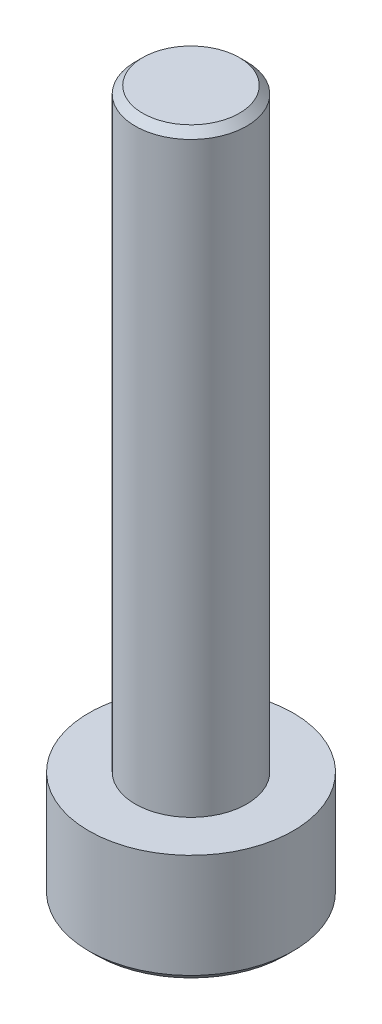
ISO-10303-21;
HEADER;
FILE_DESCRIPTION(('STEP AP214'),'2;1');
FILE_NAME('part.step','',(''),(''),'','','');
FILE_SCHEMA(('AUTOMOTIVE_DESIGN { 1 0 10303 214 1 1 1 1 }'));
ENDSEC;
DATA;
#1=APPLICATION_CONTEXT('core data for automotive mechanical design processes');
#2=APPLICATION_PROTOCOL_DEFINITION('international standard','automotive_design',2000,#1);
#3=PRODUCT_CONTEXT('',#1,'mechanical');
#4=PRODUCT('Part','Part','',(#3));
#5=PRODUCT_RELATED_PRODUCT_CATEGORY('part','',(#4));
#6=PRODUCT_DEFINITION_FORMATION('','',#4);
#7=PRODUCT_DEFINITION_CONTEXT('part definition',#1,'design');
#8=PRODUCT_DEFINITION('design','',#6,#7);
#9=PRODUCT_DEFINITION_SHAPE('','',#8);
#10=(LENGTH_UNIT() NAMED_UNIT(*) SI_UNIT(.MILLI.,.METRE.));
#11=(NAMED_UNIT(*) PLANE_ANGLE_UNIT() SI_UNIT($,.RADIAN.));
#12=(NAMED_UNIT(*) SI_UNIT($,.STERADIAN.) SOLID_ANGLE_UNIT());
#13=UNCERTAINTY_MEASURE_WITH_UNIT(LENGTH_MEASURE(1.E-05),#10,'distance_accuracy_value','');
#14=(GEOMETRIC_REPRESENTATION_CONTEXT(3) GLOBAL_UNCERTAINTY_ASSIGNED_CONTEXT((#13)) GLOBAL_UNIT_ASSIGNED_CONTEXT((#10,
#11,#12)) REPRESENTATION_CONTEXT('',''));
#15=CARTESIAN_POINT('',(0.,0.,0.));
#16=DIRECTION('',(0.,0.,1.));
#17=DIRECTION('',(1.,0.,0.));
#18=AXIS2_PLACEMENT_3D('',#15,#16,#17);
#19=CARTESIAN_POINT('',(0.,-3.,0.));
#20=DIRECTION('',(0.,-1.,0.));
#21=DIRECTION('',(0.,0.,-1.));
#22=AXIS2_PLACEMENT_3D('',#19,#20,#21);
#23=PLANE('',#22);
#24=CARTESIAN_POINT('',(0.,-3.,0.));
#25=DIRECTION('',(0.,-1.,0.));
#26=DIRECTION('',(0.,0.,-1.));
#27=AXIS2_PLACEMENT_3D('',#24,#25,#26);
#28=CIRCLE('',#27,2.55);
#29=CARTESIAN_POINT('',(0.,-3.,-2.55));
#30=VERTEX_POINT('',#29);
#31=EDGE_CURVE('E11',#30,#30,#28,.T.);
#32=ORIENTED_EDGE('',*,*,#31,.T.);
#33=EDGE_LOOP('',(#32));
#34=FACE_BOUND('',#33,.T.);
#35=DIRECTION('',(0.5,0.,-0.866025403784439));
#36=VECTOR('',#35,1.);
#37=CARTESIAN_POINT('',(1.44337567297406,-3.,0.));
#38=LINE('',#37,#36);
#39=CARTESIAN_POINT('',(0.721687836487032,-3.,1.25));
#40=VERTEX_POINT('',#39);
#41=CARTESIAN_POINT('',(1.44337567297406,-3.,0.));
#42=VERTEX_POINT('',#41);
#43=EDGE_CURVE('E127',#40,#42,#38,.T.);
#44=ORIENTED_EDGE('',*,*,#43,.T.);
#45=DIRECTION('',(-0.5,0.,-0.866025403784439));
#46=VECTOR('',#45,1.);
#47=CARTESIAN_POINT('',(0.721687836487032,-3.,-1.25));
#48=LINE('',#47,#46);
#49=CARTESIAN_POINT('',(0.721687836487032,-3.,-1.25));
#50=VERTEX_POINT('',#49);
#51=EDGE_CURVE('E47',#42,#50,#48,.T.);
#52=ORIENTED_EDGE('',*,*,#51,.T.);
#53=DIRECTION('',(-1.,0.,0.));
#54=VECTOR('',#53,1.);
#55=CARTESIAN_POINT('',(-0.721687836487033,-3.,-1.25));
#56=LINE('',#55,#54);
#57=CARTESIAN_POINT('',(-0.721687836487033,-3.,-1.25));
#58=VERTEX_POINT('',#57);
#59=EDGE_CURVE('E118',#50,#58,#56,.T.);
#60=ORIENTED_EDGE('',*,*,#59,.T.);
#61=DIRECTION('',(-0.5,0.,0.866025403784439));
#62=VECTOR('',#61,1.);
#63=CARTESIAN_POINT('',(-1.44337567297406,-3.,0.));
#64=LINE('',#63,#62);
#65=CARTESIAN_POINT('',(-1.44337567297406,-3.,0.));
#66=VERTEX_POINT('',#65);
#67=EDGE_CURVE('E121',#58,#66,#64,.T.);
#68=ORIENTED_EDGE('',*,*,#67,.T.);
#69=DIRECTION('',(0.5,0.,0.866025403784439));
#70=VECTOR('',#69,1.);
#71=CARTESIAN_POINT('',(-0.721687836487032,-3.,1.25));
#72=LINE('',#71,#70);
#73=CARTESIAN_POINT('',(-0.721687836487032,-3.,1.25));
#74=VERTEX_POINT('',#73);
#75=EDGE_CURVE('E124',#66,#74,#72,.T.);
#76=ORIENTED_EDGE('',*,*,#75,.T.);
#77=DIRECTION('',(1.,0.,0.));
#78=VECTOR('',#77,1.);
#79=CARTESIAN_POINT('',(0.721687836487032,-3.,1.25));
#80=LINE('',#79,#78);
#81=EDGE_CURVE('E108',#74,#40,#80,.T.);
#82=ORIENTED_EDGE('',*,*,#81,.T.);
#83=EDGE_LOOP('',(#44,#52,#60,#68,#76,#82));
#84=FACE_BOUND('',#83,.T.);
#85=ADVANCED_FACE('F33',(#34,#84),#23,.T.);
#86=CARTESIAN_POINT('',(0.,-3.,0.));
#87=DIRECTION('',(0.,1.,0.));
#88=DIRECTION('',(0.,0.,1.));
#89=AXIS2_PLACEMENT_3D('',#86,#87,#88);
#90=CONICAL_SURFACE('',#89,2.55,0.785398163397504);
#91=CARTESIAN_POINT('',(0.,-2.80000000000002,0.));
#92=DIRECTION('',(0.,-1.,0.));
#93=DIRECTION('',(0.,0.,-1.));
#94=AXIS2_PLACEMENT_3D('',#91,#92,#93);
#95=CIRCLE('',#94,2.75);
#96=CARTESIAN_POINT('',(0.,-2.80000000000002,-2.75));
#97=VERTEX_POINT('',#96);
#98=EDGE_CURVE('E40',#97,#97,#95,.T.);
#99=ORIENTED_EDGE('',*,*,#98,.T.);
#100=EDGE_LOOP('',(#99));
#101=FACE_BOUND('',#100,.T.);
#102=ORIENTED_EDGE('',*,*,#31,.F.);
#103=EDGE_LOOP('',(#102));
#104=FACE_BOUND('',#103,.T.);
#105=ADVANCED_FACE('F152',(#101,#104),#90,.T.);
#106=CARTESIAN_POINT('',(0.,-500.,0.));
#107=DIRECTION('',(0.,-1.,0.));
#108=DIRECTION('',(0.,0.,-1.));
#109=AXIS2_PLACEMENT_3D('',#106,#107,#108);
#110=CYLINDRICAL_SURFACE('',#109,2.75);
#111=CARTESIAN_POINT('',(0.,0.,0.));
#112=DIRECTION('',(0.,-1.,0.));
#113=DIRECTION('',(0.,0.,-1.));
#114=AXIS2_PLACEMENT_3D('',#111,#112,#113);
#115=CIRCLE('',#114,2.75);
#116=CARTESIAN_POINT('',(0.,0.,-2.75));
#117=VERTEX_POINT('',#116);
#118=EDGE_CURVE('E147',#117,#117,#115,.T.);
#119=ORIENTED_EDGE('',*,*,#118,.T.);
#120=EDGE_LOOP('',(#119));
#121=FACE_BOUND('',#120,.T.);
#122=ORIENTED_EDGE('',*,*,#98,.F.);
#123=EDGE_LOOP('',(#122));
#124=FACE_BOUND('',#123,.T.);
#125=ADVANCED_FACE('F155',(#121,#124),#110,.T.);
#126=CARTESIAN_POINT('',(2.75,0.,0.));
#127=DIRECTION('',(0.,1.,0.));
#128=DIRECTION('',(0.,0.,1.));
#129=AXIS2_PLACEMENT_3D('',#126,#127,#128);
#130=PLANE('',#129);
#131=CARTESIAN_POINT('',(0.,0.,0.));
#132=DIRECTION('',(0.,-1.,0.));
#133=DIRECTION('',(0.,0.,-1.));
#134=AXIS2_PLACEMENT_3D('',#131,#132,#133);
#135=CIRCLE('',#134,1.5);
#136=CARTESIAN_POINT('',(0.,0.,-1.5));
#137=VERTEX_POINT('',#136);
#138=EDGE_CURVE('E144',#137,#137,#135,.T.);
#139=ORIENTED_EDGE('',*,*,#138,.T.);
#140=EDGE_LOOP('',(#139));
#141=FACE_BOUND('',#140,.T.);
#142=ORIENTED_EDGE('',*,*,#118,.F.);
#143=EDGE_LOOP('',(#142));
#144=FACE_BOUND('',#143,.T.);
#145=ADVANCED_FACE('F157',(#141,#144),#130,.T.);
#146=CARTESIAN_POINT('',(0.,-500.,0.));
#147=DIRECTION('',(0.,-1.,0.));
#148=DIRECTION('',(0.,0.,-1.));
#149=AXIS2_PLACEMENT_3D('',#146,#147,#148);
#150=CYLINDRICAL_SURFACE('',#149,1.5);
#151=CARTESIAN_POINT('',(0.,15.8,0.));
#152=DIRECTION('',(0.,-1.,0.));
#153=DIRECTION('',(0.,0.,-1.));
#154=AXIS2_PLACEMENT_3D('',#151,#152,#153);
#155=CIRCLE('',#154,1.5);
#156=CARTESIAN_POINT('',(0.,15.8,-1.5));
#157=VERTEX_POINT('',#156);
#158=EDGE_CURVE('E141',#157,#157,#155,.T.);
#159=ORIENTED_EDGE('',*,*,#158,.T.);
#160=EDGE_LOOP('',(#159));
#161=FACE_BOUND('',#160,.T.);
#162=ORIENTED_EDGE('',*,*,#138,.F.);
#163=EDGE_LOOP('',(#162));
#164=FACE_BOUND('',#163,.T.);
#165=ADVANCED_FACE('F164',(#161,#164),#150,.T.);
#166=CARTESIAN_POINT('',(0.,15.8,0.));
#167=DIRECTION('',(0.,-1.,0.));
#168=DIRECTION('',(0.,0.,-1.));
#169=AXIS2_PLACEMENT_3D('',#166,#167,#168);
#170=CONICAL_SURFACE('',#169,1.5,0.785398163397504);
#171=CARTESIAN_POINT('',(0.,16.,0.));
#172=DIRECTION('',(0.,-1.,0.));
#173=DIRECTION('',(0.,0.,-1.));
#174=AXIS2_PLACEMENT_3D('',#171,#172,#173);
#175=CIRCLE('',#174,1.3);
#176=CARTESIAN_POINT('',(0.,16.,-1.3));
#177=VERTEX_POINT('',#176);
#178=EDGE_CURVE('E138',#177,#177,#175,.T.);
#179=ORIENTED_EDGE('',*,*,#178,.T.);
#180=EDGE_LOOP('',(#179));
#181=FACE_BOUND('',#180,.T.);
#182=ORIENTED_EDGE('',*,*,#158,.F.);
#183=EDGE_LOOP('',(#182));
#184=FACE_BOUND('',#183,.T.);
#185=ADVANCED_FACE('F197',(#181,#184),#170,.T.);
#186=CARTESIAN_POINT('',(1.3,16.,0.));
#187=DIRECTION('',(0.,1.,0.));
#188=DIRECTION('',(0.,0.,1.));
#189=AXIS2_PLACEMENT_3D('',#186,#187,#188);
#190=PLANE('',#189);
#191=ORIENTED_EDGE('',*,*,#178,.F.);
#192=EDGE_LOOP('',(#191));
#193=FACE_BOUND('',#192,.T.);
#194=ADVANCED_FACE('F191',(#193),#190,.T.);
#195=CARTESIAN_POINT('',(0.721687836487032,-1.5,-1.25));
#196=DIRECTION('',(-0.866025403784439,0.,0.5));
#197=DIRECTION('',(0.5,0.,0.866025403784439));
#198=AXIS2_PLACEMENT_3D('',#195,#196,#197);
#199=PLANE('',#198);
#200=ORIENTED_EDGE('',*,*,#51,.F.);
#201=DIRECTION('',(0.,-1.,0.));
#202=VECTOR('',#201,1.);
#203=CARTESIAN_POINT('',(1.44337567297406,-1.5,0.));
#204=LINE('',#203,#202);
#205=CARTESIAN_POINT('',(1.44337567297406,-1.5,0.));
#206=VERTEX_POINT('',#205);
#207=EDGE_CURVE('E113',#206,#42,#204,.T.);
#208=ORIENTED_EDGE('',*,*,#207,.F.);
#209=DIRECTION('',(-0.5,0.,-0.866025403784439));
#210=VECTOR('',#209,1.);
#211=CARTESIAN_POINT('',(0.721687836487032,-1.5,-1.25));
#212=LINE('',#211,#210);
#213=CARTESIAN_POINT('',(0.721687836487032,-1.5,-1.25));
#214=VERTEX_POINT('',#213);
#215=EDGE_CURVE('E130',#206,#214,#212,.T.);
#216=ORIENTED_EDGE('',*,*,#215,.T.);
#217=DIRECTION('',(0.,-1.,0.));
#218=VECTOR('',#217,1.);
#219=CARTESIAN_POINT('',(0.721687836487032,-1.5,-1.25));
#220=LINE('',#219,#218);
#221=EDGE_CURVE('E136',#214,#50,#220,.T.);
#222=ORIENTED_EDGE('',*,*,#221,.T.);
#223=EDGE_LOOP('',(#200,#208,#216,#222));
#224=FACE_BOUND('',#223,.T.);
#225=ADVANCED_FACE('F174',(#224),#199,.T.);
#226=CARTESIAN_POINT('',(-0.721687836487033,-1.5,-1.25));
#227=DIRECTION('',(0.,0.,1.));
#228=DIRECTION('',(1.,0.,0.));
#229=AXIS2_PLACEMENT_3D('',#226,#227,#228);
#230=PLANE('',#229);
#231=ORIENTED_EDGE('',*,*,#59,.F.);
#232=ORIENTED_EDGE('',*,*,#221,.F.);
#233=DIRECTION('',(-1.,0.,0.));
#234=VECTOR('',#233,1.);
#235=CARTESIAN_POINT('',(-0.721687836487033,-1.5,-1.25));
#236=LINE('',#235,#234);
#237=CARTESIAN_POINT('',(-0.721687836487033,-1.5,-1.25));
#238=VERTEX_POINT('',#237);
#239=EDGE_CURVE('E86',#214,#238,#236,.T.);
#240=ORIENTED_EDGE('',*,*,#239,.T.);
#241=DIRECTION('',(0.,-1.,0.));
#242=VECTOR('',#241,1.);
#243=CARTESIAN_POINT('',(-0.721687836487033,-1.5,-1.25));
#244=LINE('',#243,#242);
#245=EDGE_CURVE('E134',#238,#58,#244,.T.);
#246=ORIENTED_EDGE('',*,*,#245,.T.);
#247=EDGE_LOOP('',(#231,#232,#240,#246));
#248=FACE_BOUND('',#247,.T.);
#249=ADVANCED_FACE('F183',(#248),#230,.T.);
#250=CARTESIAN_POINT('',(-1.44337567297406,-1.5,0.));
#251=DIRECTION('',(0.866025403784439,0.,0.5));
#252=DIRECTION('',(0.5,0.,-0.866025403784439));
#253=AXIS2_PLACEMENT_3D('',#250,#251,#252);
#254=PLANE('',#253);
#255=ORIENTED_EDGE('',*,*,#67,.F.);
#256=ORIENTED_EDGE('',*,*,#245,.F.);
#257=DIRECTION('',(-0.5,0.,0.866025403784439));
#258=VECTOR('',#257,1.);
#259=CARTESIAN_POINT('',(-1.44337567297406,-1.5,0.));
#260=LINE('',#259,#258);
#261=CARTESIAN_POINT('',(-1.44337567297406,-1.5,0.));
#262=VERTEX_POINT('',#261);
#263=EDGE_CURVE('E104',#238,#262,#260,.T.);
#264=ORIENTED_EDGE('',*,*,#263,.T.);
#265=DIRECTION('',(0.,-1.,0.));
#266=VECTOR('',#265,1.);
#267=CARTESIAN_POINT('',(-1.44337567297406,-1.5,0.));
#268=LINE('',#267,#266);
#269=EDGE_CURVE('E101',#262,#66,#268,.T.);
#270=ORIENTED_EDGE('',*,*,#269,.T.);
#271=EDGE_LOOP('',(#255,#256,#264,#270));
#272=FACE_BOUND('',#271,.T.);
#273=ADVANCED_FACE('F181',(#272),#254,.T.);
#274=CARTESIAN_POINT('',(-0.721687836487032,-1.5,1.25));
#275=DIRECTION('',(0.866025403784438,0.,-0.5));
#276=DIRECTION('',(-0.5,0.,-0.866025403784439));
#277=AXIS2_PLACEMENT_3D('',#274,#275,#276);
#278=PLANE('',#277);
#279=ORIENTED_EDGE('',*,*,#75,.F.);
#280=ORIENTED_EDGE('',*,*,#269,.F.);
#281=DIRECTION('',(0.5,0.,0.866025403784439));
#282=VECTOR('',#281,1.);
#283=CARTESIAN_POINT('',(-0.721687836487032,-1.5,1.25));
#284=LINE('',#283,#282);
#285=CARTESIAN_POINT('',(-0.721687836487032,-1.5,1.25));
#286=VERTEX_POINT('',#285);
#287=EDGE_CURVE('E96',#262,#286,#284,.T.);
#288=ORIENTED_EDGE('',*,*,#287,.T.);
#289=DIRECTION('',(0.,-1.,0.));
#290=VECTOR('',#289,1.);
#291=CARTESIAN_POINT('',(-0.721687836487032,-1.5,1.25));
#292=LINE('',#291,#290);
#293=EDGE_CURVE('E100',#286,#74,#292,.T.);
#294=ORIENTED_EDGE('',*,*,#293,.T.);
#295=EDGE_LOOP('',(#279,#280,#288,#294));
#296=FACE_BOUND('',#295,.T.);
#297=ADVANCED_FACE('F99',(#296),#278,.T.);
#298=CARTESIAN_POINT('',(0.721687836487032,-1.5,1.25));
#299=DIRECTION('',(0.,0.,-1.));
#300=DIRECTION('',(-1.,0.,0.));
#301=AXIS2_PLACEMENT_3D('',#298,#299,#300);
#302=PLANE('',#301);
#303=ORIENTED_EDGE('',*,*,#81,.F.);
#304=ORIENTED_EDGE('',*,*,#293,.F.);
#305=DIRECTION('',(1.,0.,0.));
#306=VECTOR('',#305,1.);
#307=CARTESIAN_POINT('',(0.721687836487032,-1.5,1.25));
#308=LINE('',#307,#306);
#309=CARTESIAN_POINT('',(0.721687836487032,-1.5,1.25));
#310=VERTEX_POINT('',#309);
#311=EDGE_CURVE('E103',#286,#310,#308,.T.);
#312=ORIENTED_EDGE('',*,*,#311,.T.);
#313=DIRECTION('',(0.,-1.,0.));
#314=VECTOR('',#313,1.);
#315=CARTESIAN_POINT('',(0.721687836487032,-1.5,1.25));
#316=LINE('',#315,#314);
#317=EDGE_CURVE('E77',#310,#40,#316,.T.);
#318=ORIENTED_EDGE('',*,*,#317,.T.);
#319=EDGE_LOOP('',(#303,#304,#312,#318));
#320=FACE_BOUND('',#319,.T.);
#321=ADVANCED_FACE('F106',(#320),#302,.T.);
#322=CARTESIAN_POINT('',(1.44337567297406,-1.5,0.));
#323=DIRECTION('',(-0.866025403784439,0.,-0.5));
#324=DIRECTION('',(-0.5,0.,0.866025403784439));
#325=AXIS2_PLACEMENT_3D('',#322,#323,#324);
#326=PLANE('',#325);
#327=ORIENTED_EDGE('',*,*,#43,.F.);
#328=ORIENTED_EDGE('',*,*,#317,.F.);
#329=DIRECTION('',(0.5,0.,-0.866025403784439));
#330=VECTOR('',#329,1.);
#331=CARTESIAN_POINT('',(1.44337567297406,-1.5,0.));
#332=LINE('',#331,#330);
#333=EDGE_CURVE('E55',#310,#206,#332,.T.);
#334=ORIENTED_EDGE('',*,*,#333,.T.);
#335=ORIENTED_EDGE('',*,*,#207,.T.);
#336=EDGE_LOOP('',(#327,#328,#334,#335));
#337=FACE_BOUND('',#336,.T.);
#338=ADVANCED_FACE('F173',(#337),#326,.T.);
#339=CARTESIAN_POINT('',(0.,-1.5,0.));
#340=DIRECTION('',(0.,-1.,0.));
#341=DIRECTION('',(0.,0.,-1.));
#342=AXIS2_PLACEMENT_3D('',#339,#340,#341);
#343=PLANE('',#342);
#344=ORIENTED_EDGE('',*,*,#215,.F.);
#345=ORIENTED_EDGE('',*,*,#333,.F.);
#346=ORIENTED_EDGE('',*,*,#311,.F.);
#347=ORIENTED_EDGE('',*,*,#287,.F.);
#348=ORIENTED_EDGE('',*,*,#263,.F.);
#349=ORIENTED_EDGE('',*,*,#239,.F.);
#350=EDGE_LOOP('',(#344,#345,#346,#347,#348,#349));
#351=FACE_BOUND('',#350,.T.);
#352=ADVANCED_FACE('F111',(#351),#343,.T.);
#353=CLOSED_SHELL('',(#85,#105,#125,#145,#165,#185,#194,#225,#249,#273,#297,#321,#338,#352));
#354=MANIFOLD_SOLID_BREP('B2',#353);
#355=ADVANCED_BREP_SHAPE_REPRESENTATION('',(#18,#354),#14);
#356=SHAPE_DEFINITION_REPRESENTATION(#9,#355);
ENDSEC;
END-ISO-10303-21;
